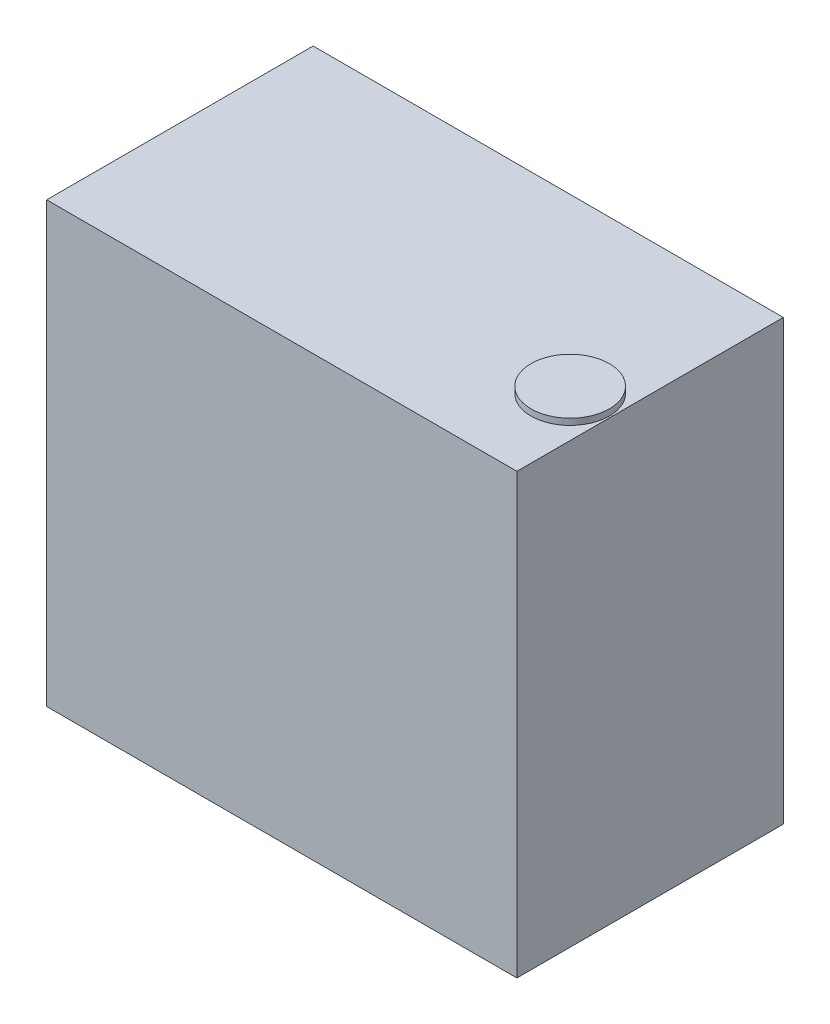
ISO-10303-21;
HEADER;
FILE_DESCRIPTION(('STEP AP214'),'2;1');
FILE_NAME('part.step','',(''),(''),'','','');
FILE_SCHEMA(('AUTOMOTIVE_DESIGN { 1 0 10303 214 1 1 1 1 }'));
ENDSEC;
DATA;
#1=APPLICATION_CONTEXT('core data for automotive mechanical design processes');
#2=APPLICATION_PROTOCOL_DEFINITION('international standard','automotive_design',2000,#1);
#3=PRODUCT_CONTEXT('',#1,'mechanical');
#4=PRODUCT('Part','Part','',(#3));
#5=PRODUCT_RELATED_PRODUCT_CATEGORY('part','',(#4));
#6=PRODUCT_DEFINITION_FORMATION('','',#4);
#7=PRODUCT_DEFINITION_CONTEXT('part definition',#1,'design');
#8=PRODUCT_DEFINITION('design','',#6,#7);
#9=PRODUCT_DEFINITION_SHAPE('','',#8);
#10=(LENGTH_UNIT() NAMED_UNIT(*) SI_UNIT(.MILLI.,.METRE.));
#11=(NAMED_UNIT(*) PLANE_ANGLE_UNIT() SI_UNIT($,.RADIAN.));
#12=(NAMED_UNIT(*) SI_UNIT($,.STERADIAN.) SOLID_ANGLE_UNIT());
#13=UNCERTAINTY_MEASURE_WITH_UNIT(LENGTH_MEASURE(1.E-05),#10,'distance_accuracy_value','');
#14=(GEOMETRIC_REPRESENTATION_CONTEXT(3) GLOBAL_UNCERTAINTY_ASSIGNED_CONTEXT((#13)) GLOBAL_UNIT_ASSIGNED_CONTEXT((#10,
#11,#12)) REPRESENTATION_CONTEXT('',''));
#15=CARTESIAN_POINT('',(0.,0.,0.));
#16=DIRECTION('',(0.,0.,1.));
#17=DIRECTION('',(1.,0.,0.));
#18=AXIS2_PLACEMENT_3D('',#15,#16,#17);
#19=CARTESIAN_POINT('',(0.,0.,85.));
#20=DIRECTION('',(0.,1.,0.));
#21=DIRECTION('',(0.,0.,1.));
#22=AXIS2_PLACEMENT_3D('',#19,#20,#21);
#23=PLANE('',#22);
#24=CARTESIAN_POINT('',(143.,0.,80.));
#25=DIRECTION('',(0.,-1.,0.));
#26=DIRECTION('',(0.,0.,-1.));
#27=AXIS2_PLACEMENT_3D('',#24,#25,#26);
#28=CIRCLE('',#27,1.5);
#29=CARTESIAN_POINT('',(143.,0.,78.5));
#30=VERTEX_POINT('',#29);
#31=EDGE_CURVE('E689',#30,#30,#28,.T.);
#32=ORIENTED_EDGE('',*,*,#31,.F.);
#33=EDGE_LOOP('',(#32));
#34=FACE_BOUND('',#33,.T.);
#35=CARTESIAN_POINT('',(120.,0.,6.00000000000001));
#36=DIRECTION('',(0.,-1.,0.));
#37=DIRECTION('',(0.,0.,-1.));
#38=AXIS2_PLACEMENT_3D('',#35,#36,#37);
#39=CIRCLE('',#38,1.5);
#40=CARTESIAN_POINT('',(120.,0.,4.50000000000001));
#41=VERTEX_POINT('',#40);
#42=EDGE_CURVE('E698',#41,#41,#39,.T.);
#43=ORIENTED_EDGE('',*,*,#42,.F.);
#44=EDGE_LOOP('',(#43));
#45=FACE_BOUND('',#44,.T.);
#46=CARTESIAN_POINT('',(5.,0.,15.));
#47=DIRECTION('',(0.,-1.,0.));
#48=DIRECTION('',(0.,0.,-1.));
#49=AXIS2_PLACEMENT_3D('',#46,#47,#48);
#50=CIRCLE('',#49,1.5);
#51=CARTESIAN_POINT('',(5.,0.,13.5));
#52=VERTEX_POINT('',#51);
#53=EDGE_CURVE('E677',#52,#52,#50,.T.);
#54=ORIENTED_EDGE('',*,*,#53,.F.);
#55=EDGE_LOOP('',(#54));
#56=FACE_BOUND('',#55,.T.);
#57=CARTESIAN_POINT('',(5.,0.,80.));
#58=DIRECTION('',(0.,-1.,0.));
#59=DIRECTION('',(0.,0.,-1.));
#60=AXIS2_PLACEMENT_3D('',#57,#58,#59);
#61=CIRCLE('',#60,1.5);
#62=CARTESIAN_POINT('',(5.,0.,78.5));
#63=VERTEX_POINT('',#62);
#64=EDGE_CURVE('E674',#63,#63,#61,.T.);
#65=ORIENTED_EDGE('',*,*,#64,.F.);
#66=EDGE_LOOP('',(#65));
#67=FACE_BOUND('',#66,.T.);
#68=DIRECTION('',(1.,0.,0.));
#69=VECTOR('',#68,1.);
#70=CARTESIAN_POINT('',(0.,0.,55.));
#71=LINE('',#70,#69);
#72=CARTESIAN_POINT('',(110.,0.,55.));
#73=VERTEX_POINT('',#72);
#74=CARTESIAN_POINT('',(130.,0.,55.));
#75=VERTEX_POINT('',#74);
#76=EDGE_CURVE('E169',#73,#75,#71,.T.);
#77=ORIENTED_EDGE('',*,*,#76,.F.);
#78=DIRECTION('',(0.,0.,1.));
#79=VECTOR('',#78,1.);
#80=CARTESIAN_POINT('',(110.,0.,1.01770443923973E-13));
#81=LINE('',#80,#79);
#82=CARTESIAN_POINT('',(110.,0.,70.));
#83=VERTEX_POINT('',#82);
#84=EDGE_CURVE('E228',#73,#83,#81,.T.);
#85=ORIENTED_EDGE('',*,*,#84,.T.);
#86=DIRECTION('',(1.,0.,0.));
#87=VECTOR('',#86,1.);
#88=CARTESIAN_POINT('',(0.,0.,70.));
#89=LINE('',#88,#87);
#90=CARTESIAN_POINT('',(130.,0.,70.));
#91=VERTEX_POINT('',#90);
#92=EDGE_CURVE('E67',#83,#91,#89,.T.);
#93=ORIENTED_EDGE('',*,*,#92,.T.);
#94=DIRECTION('',(0.,0.,1.));
#95=VECTOR('',#94,1.);
#96=CARTESIAN_POINT('',(130.,0.,0.));
#97=LINE('',#96,#95);
#98=EDGE_CURVE('E243',#75,#91,#97,.T.);
#99=ORIENTED_EDGE('',*,*,#98,.F.);
#100=EDGE_LOOP('',(#77,#85,#93,#99));
#101=FACE_BOUND('',#100,.T.);
#102=DIRECTION('',(1.,0.,0.));
#103=VECTOR('',#102,1.);
#104=CARTESIAN_POINT('',(0.,0.,0.));
#105=LINE('',#104,#103);
#106=CARTESIAN_POINT('',(0.,0.,0.));
#107=VERTEX_POINT('',#106);
#108=CARTESIAN_POINT('',(150.,0.,0.));
#109=VERTEX_POINT('',#108);
#110=EDGE_CURVE('E282',#107,#109,#105,.T.);
#111=ORIENTED_EDGE('',*,*,#110,.T.);
#112=DIRECTION('',(0.,0.,-1.));
#113=VECTOR('',#112,1.);
#114=CARTESIAN_POINT('',(150.,0.,85.));
#115=LINE('',#114,#113);
#116=CARTESIAN_POINT('',(150.,0.,85.));
#117=VERTEX_POINT('',#116);
#118=EDGE_CURVE('E297',#117,#109,#115,.T.);
#119=ORIENTED_EDGE('',*,*,#118,.F.);
#120=DIRECTION('',(1.,0.,0.));
#121=VECTOR('',#120,1.);
#122=CARTESIAN_POINT('',(0.,0.,85.));
#123=LINE('',#122,#121);
#124=CARTESIAN_POINT('',(0.,0.,85.));
#125=VERTEX_POINT('',#124);
#126=EDGE_CURVE('E268',#125,#117,#123,.T.);
#127=ORIENTED_EDGE('',*,*,#126,.F.);
#128=DIRECTION('',(0.,0.,-1.));
#129=VECTOR('',#128,1.);
#130=CARTESIAN_POINT('',(0.,0.,85.));
#131=LINE('',#130,#129);
#132=EDGE_CURVE('E52',#125,#107,#131,.T.);
#133=ORIENTED_EDGE('',*,*,#132,.T.);
#134=EDGE_LOOP('',(#111,#119,#127,#133));
#135=FACE_BOUND('',#134,.T.);
#136=DIRECTION('',(1.,0.,0.));
#137=VECTOR('',#136,1.);
#138=CARTESIAN_POINT('',(0.,0.,13.));
#139=LINE('',#138,#137);
#140=CARTESIAN_POINT('',(104.,0.,13.));
#141=VERTEX_POINT('',#140);
#142=CARTESIAN_POINT('',(134.,0.,13.));
#143=VERTEX_POINT('',#142);
#144=EDGE_CURVE('E164',#141,#143,#139,.T.);
#145=ORIENTED_EDGE('',*,*,#144,.F.);
#146=DIRECTION('',(-0.672672793996313,0.,0.739940073395943));
#147=VECTOR('',#146,1.);
#148=CARTESIAN_POINT('',(63.4117647058823,0.,57.6470588235294));
#149=LINE('',#148,#147);
#150=CARTESIAN_POINT('',(94.,0.,24.));
#151=VERTEX_POINT('',#150);
#152=EDGE_CURVE('E158',#141,#151,#149,.T.);
#153=ORIENTED_EDGE('',*,*,#152,.T.);
#154=DIRECTION('',(0.672672793996313,0.,0.739940073395943));
#155=VECTOR('',#154,1.);
#156=CARTESIAN_POINT('',(39.5203619909502,0.,-35.9276018099548));
#157=LINE('',#156,#155);
#158=CARTESIAN_POINT('',(104.,0.,35.));
#159=VERTEX_POINT('',#158);
#160=EDGE_CURVE('E59',#151,#159,#157,.T.);
#161=ORIENTED_EDGE('',*,*,#160,.T.);
#162=DIRECTION('',(1.,0.,0.));
#163=VECTOR('',#162,1.);
#164=CARTESIAN_POINT('',(0.,0.,35.));
#165=LINE('',#164,#163);
#166=CARTESIAN_POINT('',(134.,0.,35.));
#167=VERTEX_POINT('',#166);
#168=EDGE_CURVE('E201',#159,#167,#165,.T.);
#169=ORIENTED_EDGE('',*,*,#168,.T.);
#170=DIRECTION('',(0.672672793996313,0.,-0.739940073395943));
#171=VECTOR('',#170,1.);
#172=CARTESIAN_POINT('',(90.787330316742,0.,82.5339366515837));
#173=LINE('',#172,#171);
#174=CARTESIAN_POINT('',(144.,0.,24.));
#175=VERTEX_POINT('',#174);
#176=EDGE_CURVE('E197',#167,#175,#173,.T.);
#177=ORIENTED_EDGE('',*,*,#176,.T.);
#178=DIRECTION('',(-0.672672793996313,0.,-0.739940073395943));
#179=VECTOR('',#178,1.);
#180=CARTESIAN_POINT('',(66.8959276018099,0.,-60.8144796380091));
#181=LINE('',#180,#179);
#182=EDGE_CURVE('E193',#175,#143,#181,.T.);
#183=ORIENTED_EDGE('',*,*,#182,.T.);
#184=EDGE_LOOP('',(#145,#153,#161,#169,#177,#183));
#185=FACE_BOUND('',#184,.T.);
#186=ADVANCED_FACE('F43',(#34,#45,#56,#67,#101,#135,#185),#23,.F.);
#187=CARTESIAN_POINT('',(0.,0.,85.));
#188=DIRECTION('',(1.,0.,0.));
#189=DIRECTION('',(0.,0.,-1.));
#190=AXIS2_PLACEMENT_3D('',#187,#188,#189);
#191=PLANE('',#190);
#192=DIRECTION('',(0.,-1.,0.));
#193=VECTOR('',#192,1.);
#194=CARTESIAN_POINT('',(0.,0.,0.));
#195=LINE('',#194,#193);
#196=CARTESIAN_POINT('',(0.,140.,0.));
#197=VERTEX_POINT('',#196);
#198=EDGE_CURVE('E263',#197,#107,#195,.T.);
#199=ORIENTED_EDGE('',*,*,#198,.T.);
#200=ORIENTED_EDGE('',*,*,#132,.F.);
#201=DIRECTION('',(0.,-1.,0.));
#202=VECTOR('',#201,1.);
#203=CARTESIAN_POINT('',(0.,0.,85.));
#204=LINE('',#203,#202);
#205=CARTESIAN_POINT('',(0.,140.,85.));
#206=VERTEX_POINT('',#205);
#207=EDGE_CURVE('E264',#206,#125,#204,.T.);
#208=ORIENTED_EDGE('',*,*,#207,.F.);
#209=DIRECTION('',(0.,0.,-1.));
#210=VECTOR('',#209,1.);
#211=CARTESIAN_POINT('',(0.,140.,85.));
#212=LINE('',#211,#210);
#213=EDGE_CURVE('E278',#206,#197,#212,.T.);
#214=ORIENTED_EDGE('',*,*,#213,.T.);
#215=EDGE_LOOP('',(#199,#200,#208,#214));
#216=FACE_BOUND('',#215,.T.);
#217=ADVANCED_FACE('F45',(#216),#191,.F.);
#218=CARTESIAN_POINT('',(150.,0.,85.));
#219=DIRECTION('',(-1.,0.,0.));
#220=DIRECTION('',(0.,-1.,0.));
#221=AXIS2_PLACEMENT_3D('',#218,#219,#220);
#222=PLANE('',#221);
#223=DIRECTION('',(0.,1.,0.));
#224=VECTOR('',#223,1.);
#225=CARTESIAN_POINT('',(150.,0.,0.));
#226=LINE('',#225,#224);
#227=CARTESIAN_POINT('',(150.,140.,0.));
#228=VERTEX_POINT('',#227);
#229=EDGE_CURVE('E285',#109,#228,#226,.T.);
#230=ORIENTED_EDGE('',*,*,#229,.T.);
#231=DIRECTION('',(0.,0.,-1.));
#232=VECTOR('',#231,1.);
#233=CARTESIAN_POINT('',(150.,140.,85.));
#234=LINE('',#233,#232);
#235=CARTESIAN_POINT('',(150.,140.,85.));
#236=VERTEX_POINT('',#235);
#237=EDGE_CURVE('E293',#236,#228,#234,.T.);
#238=ORIENTED_EDGE('',*,*,#237,.F.);
#239=DIRECTION('',(0.,1.,0.));
#240=VECTOR('',#239,1.);
#241=CARTESIAN_POINT('',(150.,0.,85.));
#242=LINE('',#241,#240);
#243=EDGE_CURVE('E272',#117,#236,#242,.T.);
#244=ORIENTED_EDGE('',*,*,#243,.F.);
#245=ORIENTED_EDGE('',*,*,#118,.T.);
#246=EDGE_LOOP('',(#230,#238,#244,#245));
#247=FACE_BOUND('',#246,.T.);
#248=ADVANCED_FACE('F316',(#247),#222,.F.);
#249=CARTESIAN_POINT('',(0.,140.,85.));
#250=DIRECTION('',(0.,-1.,0.));
#251=DIRECTION('',(0.,0.,-1.));
#252=AXIS2_PLACEMENT_3D('',#249,#250,#251);
#253=PLANE('',#252);
#254=CARTESIAN_POINT('',(137.,140.,55.));
#255=DIRECTION('',(0.,-1.,0.));
#256=DIRECTION('',(0.,0.,-1.));
#257=AXIS2_PLACEMENT_3D('',#254,#255,#256);
#258=CIRCLE('',#257,12.5);
#259=CARTESIAN_POINT('',(137.,140.,42.5));
#260=VERTEX_POINT('',#259);
#261=EDGE_CURVE('E11',#260,#260,#258,.F.);
#262=ORIENTED_EDGE('',*,*,#261,.F.);
#263=EDGE_LOOP('',(#262));
#264=FACE_BOUND('',#263,.T.);
#265=DIRECTION('',(-1.,0.,0.));
#266=VECTOR('',#265,1.);
#267=CARTESIAN_POINT('',(0.,140.,0.));
#268=LINE('',#267,#266);
#269=EDGE_CURVE('E269',#228,#197,#268,.T.);
#270=ORIENTED_EDGE('',*,*,#269,.T.);
#271=ORIENTED_EDGE('',*,*,#213,.F.);
#272=DIRECTION('',(-1.,0.,0.));
#273=VECTOR('',#272,1.);
#274=CARTESIAN_POINT('',(0.,140.,85.));
#275=LINE('',#274,#273);
#276=EDGE_CURVE('E275',#236,#206,#275,.T.);
#277=ORIENTED_EDGE('',*,*,#276,.F.);
#278=ORIENTED_EDGE('',*,*,#237,.T.);
#279=EDGE_LOOP('',(#270,#271,#277,#278));
#280=FACE_BOUND('',#279,.T.);
#281=ADVANCED_FACE('F320',(#264,#280),#253,.F.);
#282=CARTESIAN_POINT('',(0.,0.,85.));
#283=DIRECTION('',(0.,0.,-1.));
#284=DIRECTION('',(-1.,0.,0.));
#285=AXIS2_PLACEMENT_3D('',#282,#283,#284);
#286=PLANE('',#285);
#287=ORIENTED_EDGE('',*,*,#207,.T.);
#288=ORIENTED_EDGE('',*,*,#126,.T.);
#289=ORIENTED_EDGE('',*,*,#243,.T.);
#290=ORIENTED_EDGE('',*,*,#276,.T.);
#291=EDGE_LOOP('',(#287,#288,#289,#290));
#292=FACE_BOUND('',#291,.T.);
#293=ADVANCED_FACE('F322',(#292),#286,.F.);
#294=CARTESIAN_POINT('',(0.,0.,0.));
#295=DIRECTION('',(0.,0.,-1.));
#296=DIRECTION('',(-1.,0.,0.));
#297=AXIS2_PLACEMENT_3D('',#294,#295,#296);
#298=PLANE('',#297);
#299=ORIENTED_EDGE('',*,*,#198,.F.);
#300=ORIENTED_EDGE('',*,*,#269,.F.);
#301=ORIENTED_EDGE('',*,*,#229,.F.);
#302=ORIENTED_EDGE('',*,*,#110,.F.);
#303=EDGE_LOOP('',(#299,#300,#301,#302));
#304=FACE_BOUND('',#303,.T.);
#305=ADVANCED_FACE('F312',(#304),#298,.T.);
#306=CARTESIAN_POINT('',(0.,-4.,55.));
#307=DIRECTION('',(0.,0.,1.));
#308=DIRECTION('',(1.,0.,0.));
#309=AXIS2_PLACEMENT_3D('',#306,#307,#308);
#310=PLANE('',#309);
#311=ORIENTED_EDGE('',*,*,#76,.T.);
#312=DIRECTION('',(0.,1.,0.));
#313=VECTOR('',#312,1.);
#314=CARTESIAN_POINT('',(130.,-4.,55.));
#315=LINE('',#314,#313);
#316=CARTESIAN_POINT('',(130.,-4.,55.));
#317=VERTEX_POINT('',#316);
#318=EDGE_CURVE('E260',#317,#75,#315,.T.);
#319=ORIENTED_EDGE('',*,*,#318,.F.);
#320=DIRECTION('',(1.,0.,0.));
#321=VECTOR('',#320,1.);
#322=CARTESIAN_POINT('',(0.,-4.,55.));
#323=LINE('',#322,#321);
#324=CARTESIAN_POINT('',(110.,-4.,55.));
#325=VERTEX_POINT('',#324);
#326=EDGE_CURVE('E223',#325,#317,#323,.T.);
#327=ORIENTED_EDGE('',*,*,#326,.F.);
#328=DIRECTION('',(0.,1.,0.));
#329=VECTOR('',#328,1.);
#330=CARTESIAN_POINT('',(110.,-4.,55.));
#331=LINE('',#330,#329);
#332=EDGE_CURVE('E239',#325,#73,#331,.T.);
#333=ORIENTED_EDGE('',*,*,#332,.T.);
#334=EDGE_LOOP('',(#311,#319,#327,#333));
#335=FACE_BOUND('',#334,.T.);
#336=ADVANCED_FACE('F329',(#335),#310,.F.);
#337=CARTESIAN_POINT('',(130.,-4.,0.));
#338=DIRECTION('',(-1.,0.,0.));
#339=DIRECTION('',(0.,0.,1.));
#340=AXIS2_PLACEMENT_3D('',#337,#338,#339);
#341=PLANE('',#340);
#342=ORIENTED_EDGE('',*,*,#98,.T.);
#343=DIRECTION('',(0.,1.,0.));
#344=VECTOR('',#343,1.);
#345=CARTESIAN_POINT('',(130.,-4.,70.));
#346=LINE('',#345,#344);
#347=CARTESIAN_POINT('',(130.,-4.,70.));
#348=VERTEX_POINT('',#347);
#349=EDGE_CURVE('E257',#348,#91,#346,.T.);
#350=ORIENTED_EDGE('',*,*,#349,.F.);
#351=DIRECTION('',(0.,0.,1.));
#352=VECTOR('',#351,1.);
#353=CARTESIAN_POINT('',(130.,-4.,0.));
#354=LINE('',#353,#352);
#355=EDGE_CURVE('E227',#317,#348,#354,.T.);
#356=ORIENTED_EDGE('',*,*,#355,.F.);
#357=ORIENTED_EDGE('',*,*,#318,.T.);
#358=EDGE_LOOP('',(#342,#350,#356,#357));
#359=FACE_BOUND('',#358,.T.);
#360=ADVANCED_FACE('F552',(#359),#341,.F.);
#361=CARTESIAN_POINT('',(0.,-4.,70.));
#362=DIRECTION('',(0.,0.,1.));
#363=DIRECTION('',(1.,0.,0.));
#364=AXIS2_PLACEMENT_3D('',#361,#362,#363);
#365=PLANE('',#364);
#366=ORIENTED_EDGE('',*,*,#92,.F.);
#367=DIRECTION('',(0.,1.,0.));
#368=VECTOR('',#367,1.);
#369=CARTESIAN_POINT('',(110.,-4.,70.));
#370=LINE('',#369,#368);
#371=CARTESIAN_POINT('',(110.,-4.,70.));
#372=VERTEX_POINT('',#371);
#373=EDGE_CURVE('E254',#372,#83,#370,.T.);
#374=ORIENTED_EDGE('',*,*,#373,.F.);
#375=DIRECTION('',(1.,0.,0.));
#376=VECTOR('',#375,1.);
#377=CARTESIAN_POINT('',(0.,-4.,70.));
#378=LINE('',#377,#376);
#379=EDGE_CURVE('E231',#372,#348,#378,.T.);
#380=ORIENTED_EDGE('',*,*,#379,.T.);
#381=ORIENTED_EDGE('',*,*,#349,.T.);
#382=EDGE_LOOP('',(#366,#374,#380,#381));
#383=FACE_BOUND('',#382,.T.);
#384=ADVANCED_FACE('F542',(#383),#365,.T.);
#385=CARTESIAN_POINT('',(110.,-4.,1.01770443923973E-13));
#386=DIRECTION('',(-1.,0.,0.));
#387=DIRECTION('',(0.,0.,1.));
#388=AXIS2_PLACEMENT_3D('',#385,#386,#387);
#389=PLANE('',#388);
#390=ORIENTED_EDGE('',*,*,#84,.F.);
#391=ORIENTED_EDGE('',*,*,#332,.F.);
#392=DIRECTION('',(0.,0.,1.));
#393=VECTOR('',#392,1.);
#394=CARTESIAN_POINT('',(110.,-4.,1.01770443923973E-13));
#395=LINE('',#394,#393);
#396=EDGE_CURVE('E235',#325,#372,#395,.T.);
#397=ORIENTED_EDGE('',*,*,#396,.T.);
#398=ORIENTED_EDGE('',*,*,#373,.T.);
#399=EDGE_LOOP('',(#390,#391,#397,#398));
#400=FACE_BOUND('',#399,.T.);
#401=ADVANCED_FACE('F532',(#400),#389,.T.);
#402=CARTESIAN_POINT('',(0.,-4.,0.));
#403=DIRECTION('',(0.,-1.,0.));
#404=DIRECTION('',(0.,0.,-1.));
#405=AXIS2_PLACEMENT_3D('',#402,#403,#404);
#406=PLANE('',#405);
#407=ORIENTED_EDGE('',*,*,#326,.T.);
#408=ORIENTED_EDGE('',*,*,#355,.T.);
#409=ORIENTED_EDGE('',*,*,#379,.F.);
#410=ORIENTED_EDGE('',*,*,#396,.F.);
#411=EDGE_LOOP('',(#407,#408,#409,#410));
#412=FACE_BOUND('',#411,.T.);
#413=ADVANCED_FACE('F523',(#412),#406,.T.);
#414=CARTESIAN_POINT('',(0.,-4.,13.));
#415=DIRECTION('',(0.,0.,1.));
#416=DIRECTION('',(1.,0.,0.));
#417=AXIS2_PLACEMENT_3D('',#414,#415,#416);
#418=PLANE('',#417);
#419=ORIENTED_EDGE('',*,*,#144,.T.);
#420=DIRECTION('',(0.,1.,0.));
#421=VECTOR('',#420,1.);
#422=CARTESIAN_POINT('',(134.,-4.,13.));
#423=LINE('',#422,#421);
#424=CARTESIAN_POINT('',(134.,-4.,13.));
#425=VERTEX_POINT('',#424);
#426=EDGE_CURVE('E161',#425,#143,#423,.T.);
#427=ORIENTED_EDGE('',*,*,#426,.F.);
#428=DIRECTION('',(1.,0.,0.));
#429=VECTOR('',#428,1.);
#430=CARTESIAN_POINT('',(0.,-4.,13.));
#431=LINE('',#430,#429);
#432=CARTESIAN_POINT('',(104.,-4.,13.));
#433=VERTEX_POINT('',#432);
#434=EDGE_CURVE('E146',#433,#425,#431,.T.);
#435=ORIENTED_EDGE('',*,*,#434,.F.);
#436=DIRECTION('',(0.,1.,0.));
#437=VECTOR('',#436,1.);
#438=CARTESIAN_POINT('',(104.,-4.,13.));
#439=LINE('',#438,#437);
#440=EDGE_CURVE('E190',#433,#141,#439,.T.);
#441=ORIENTED_EDGE('',*,*,#440,.T.);
#442=EDGE_LOOP('',(#419,#427,#435,#441));
#443=FACE_BOUND('',#442,.T.);
#444=ADVANCED_FACE('F162',(#443),#418,.F.);
#445=CARTESIAN_POINT('',(66.8959276018099,-4.,-60.8144796380091));
#446=DIRECTION('',(0.739940073395944,0.,-0.672672793996313));
#447=DIRECTION('',(-0.672672793996313,0.,-0.739940073395943));
#448=AXIS2_PLACEMENT_3D('',#445,#446,#447);
#449=PLANE('',#448);
#450=ORIENTED_EDGE('',*,*,#182,.F.);
#451=DIRECTION('',(0.,1.,0.));
#452=VECTOR('',#451,1.);
#453=CARTESIAN_POINT('',(144.,-4.,24.));
#454=LINE('',#453,#452);
#455=CARTESIAN_POINT('',(144.,-4.,24.));
#456=VERTEX_POINT('',#455);
#457=EDGE_CURVE('E170',#456,#175,#454,.T.);
#458=ORIENTED_EDGE('',*,*,#457,.F.);
#459=DIRECTION('',(-0.672672793996313,0.,-0.739940073395943));
#460=VECTOR('',#459,1.);
#461=CARTESIAN_POINT('',(66.8959276018099,-4.,-60.8144796380091));
#462=LINE('',#461,#460);
#463=EDGE_CURVE('E151',#456,#425,#462,.T.);
#464=ORIENTED_EDGE('',*,*,#463,.T.);
#465=ORIENTED_EDGE('',*,*,#426,.T.);
#466=EDGE_LOOP('',(#450,#458,#464,#465));
#467=FACE_BOUND('',#466,.T.);
#468=ADVANCED_FACE('F172',(#467),#449,.T.);
#469=CARTESIAN_POINT('',(90.787330316742,-4.,82.5339366515837));
#470=DIRECTION('',(0.739940073395943,0.,0.672672793996313));
#471=DIRECTION('',(0.672672793996313,0.,-0.739940073395943));
#472=AXIS2_PLACEMENT_3D('',#469,#470,#471);
#473=PLANE('',#472);
#474=ORIENTED_EDGE('',*,*,#176,.F.);
#475=DIRECTION('',(0.,1.,0.));
#476=VECTOR('',#475,1.);
#477=CARTESIAN_POINT('',(134.,-4.,35.));
#478=LINE('',#477,#476);
#479=CARTESIAN_POINT('',(134.,-4.,35.));
#480=VERTEX_POINT('',#479);
#481=EDGE_CURVE('E218',#480,#167,#478,.T.);
#482=ORIENTED_EDGE('',*,*,#481,.F.);
#483=DIRECTION('',(0.672672793996313,0.,-0.739940073395943));
#484=VECTOR('',#483,1.);
#485=CARTESIAN_POINT('',(90.787330316742,-4.,82.5339366515837));
#486=LINE('',#485,#484);
#487=EDGE_CURVE('E174',#480,#456,#486,.T.);
#488=ORIENTED_EDGE('',*,*,#487,.T.);
#489=ORIENTED_EDGE('',*,*,#457,.T.);
#490=EDGE_LOOP('',(#474,#482,#488,#489));
#491=FACE_BOUND('',#490,.T.);
#492=ADVANCED_FACE('F496',(#491),#473,.T.);
#493=CARTESIAN_POINT('',(0.,-4.,35.));
#494=DIRECTION('',(0.,0.,1.));
#495=DIRECTION('',(1.,0.,0.));
#496=AXIS2_PLACEMENT_3D('',#493,#494,#495);
#497=PLANE('',#496);
#498=ORIENTED_EDGE('',*,*,#168,.F.);
#499=DIRECTION('',(0.,1.,0.));
#500=VECTOR('',#499,1.);
#501=CARTESIAN_POINT('',(104.,-4.,35.));
#502=LINE('',#501,#500);
#503=CARTESIAN_POINT('',(104.,-4.,35.));
#504=VERTEX_POINT('',#503);
#505=EDGE_CURVE('E215',#504,#159,#502,.T.);
#506=ORIENTED_EDGE('',*,*,#505,.F.);
#507=DIRECTION('',(1.,0.,0.));
#508=VECTOR('',#507,1.);
#509=CARTESIAN_POINT('',(0.,-4.,35.));
#510=LINE('',#509,#508);
#511=EDGE_CURVE('E177',#504,#480,#510,.T.);
#512=ORIENTED_EDGE('',*,*,#511,.T.);
#513=ORIENTED_EDGE('',*,*,#481,.T.);
#514=EDGE_LOOP('',(#498,#506,#512,#513));
#515=FACE_BOUND('',#514,.T.);
#516=ADVANCED_FACE('F487',(#515),#497,.T.);
#517=CARTESIAN_POINT('',(39.5203619909502,-4.,-35.9276018099548));
#518=DIRECTION('',(-0.739940073395943,0.,0.672672793996313));
#519=DIRECTION('',(0.672672793996313,0.,0.739940073395943));
#520=AXIS2_PLACEMENT_3D('',#517,#518,#519);
#521=PLANE('',#520);
#522=ORIENTED_EDGE('',*,*,#160,.F.);
#523=DIRECTION('',(0.,1.,0.));
#524=VECTOR('',#523,1.);
#525=CARTESIAN_POINT('',(94.,-4.,24.));
#526=LINE('',#525,#524);
#527=CARTESIAN_POINT('',(94.,-4.,24.));
#528=VERTEX_POINT('',#527);
#529=EDGE_CURVE('E212',#528,#151,#526,.T.);
#530=ORIENTED_EDGE('',*,*,#529,.F.);
#531=DIRECTION('',(0.672672793996313,0.,0.739940073395943));
#532=VECTOR('',#531,1.);
#533=CARTESIAN_POINT('',(39.5203619909502,-4.,-35.9276018099548));
#534=LINE('',#533,#532);
#535=EDGE_CURVE('E184',#528,#504,#534,.T.);
#536=ORIENTED_EDGE('',*,*,#535,.T.);
#537=ORIENTED_EDGE('',*,*,#505,.T.);
#538=EDGE_LOOP('',(#522,#530,#536,#537));
#539=FACE_BOUND('',#538,.T.);
#540=ADVANCED_FACE('F477',(#539),#521,.T.);
#541=CARTESIAN_POINT('',(63.4117647058823,-4.,57.6470588235294));
#542=DIRECTION('',(-0.739940073395944,0.,-0.672672793996313));
#543=DIRECTION('',(-0.672672793996313,0.,0.739940073395943));
#544=AXIS2_PLACEMENT_3D('',#541,#542,#543);
#545=PLANE('',#544);
#546=ORIENTED_EDGE('',*,*,#152,.F.);
#547=ORIENTED_EDGE('',*,*,#440,.F.);
#548=DIRECTION('',(-0.672672793996313,0.,0.739940073395943));
#549=VECTOR('',#548,1.);
#550=CARTESIAN_POINT('',(63.4117647058823,-4.,57.6470588235294));
#551=LINE('',#550,#549);
#552=EDGE_CURVE('E155',#433,#528,#551,.T.);
#553=ORIENTED_EDGE('',*,*,#552,.T.);
#554=ORIENTED_EDGE('',*,*,#529,.T.);
#555=EDGE_LOOP('',(#546,#547,#553,#554));
#556=FACE_BOUND('',#555,.T.);
#557=ADVANCED_FACE('F468',(#556),#545,.T.);
#558=CARTESIAN_POINT('',(0.,-4.,0.));
#559=DIRECTION('',(0.,-1.,0.));
#560=DIRECTION('',(0.,0.,-1.));
#561=AXIS2_PLACEMENT_3D('',#558,#559,#560);
#562=PLANE('',#561);
#563=ORIENTED_EDGE('',*,*,#434,.T.);
#564=ORIENTED_EDGE('',*,*,#463,.F.);
#565=ORIENTED_EDGE('',*,*,#487,.F.);
#566=ORIENTED_EDGE('',*,*,#511,.F.);
#567=ORIENTED_EDGE('',*,*,#535,.F.);
#568=ORIENTED_EDGE('',*,*,#552,.F.);
#569=EDGE_LOOP('',(#563,#564,#565,#566,#567,#568));
#570=FACE_BOUND('',#569,.T.);
#571=ADVANCED_FACE('F148',(#570),#562,.T.);
#572=CARTESIAN_POINT('',(5.,10.,80.));
#573=DIRECTION('',(0.,-1.,0.));
#574=DIRECTION('',(0.,0.,-1.));
#575=AXIS2_PLACEMENT_3D('',#572,#573,#574);
#576=CYLINDRICAL_SURFACE('',#575,1.5);
#577=CARTESIAN_POINT('',(5.,10.,80.));
#578=DIRECTION('',(0.,-1.,0.));
#579=DIRECTION('',(0.,0.,-1.));
#580=AXIS2_PLACEMENT_3D('',#577,#578,#579);
#581=CIRCLE('',#580,1.5);
#582=CARTESIAN_POINT('',(5.,10.,78.5));
#583=VERTEX_POINT('',#582);
#584=EDGE_CURVE('E194',#583,#583,#581,.T.);
#585=ORIENTED_EDGE('',*,*,#584,.F.);
#586=EDGE_LOOP('',(#585));
#587=FACE_BOUND('',#586,.T.);
#588=ORIENTED_EDGE('',*,*,#64,.T.);
#589=EDGE_LOOP('',(#588));
#590=FACE_BOUND('',#589,.T.);
#591=ADVANCED_FACE('F448',(#587,#590),#576,.F.);
#592=CARTESIAN_POINT('',(5.,10.,80.));
#593=DIRECTION('',(0.,-1.,0.));
#594=DIRECTION('',(0.,0.,-1.));
#595=AXIS2_PLACEMENT_3D('',#592,#593,#594);
#596=PLANE('',#595);
#597=ORIENTED_EDGE('',*,*,#584,.T.);
#598=EDGE_LOOP('',(#597));
#599=FACE_BOUND('',#598,.T.);
#600=ADVANCED_FACE('F438',(#599),#596,.T.);
#601=CARTESIAN_POINT('',(5.,10.,15.));
#602=DIRECTION('',(0.,-1.,0.));
#603=DIRECTION('',(0.,0.,-1.));
#604=AXIS2_PLACEMENT_3D('',#601,#602,#603);
#605=CYLINDRICAL_SURFACE('',#604,1.5);
#606=CARTESIAN_POINT('',(5.,10.,15.));
#607=DIRECTION('',(0.,-1.,0.));
#608=DIRECTION('',(0.,0.,-1.));
#609=AXIS2_PLACEMENT_3D('',#606,#607,#608);
#610=CIRCLE('',#609,1.5);
#611=CARTESIAN_POINT('',(5.,10.,13.5));
#612=VERTEX_POINT('',#611);
#613=EDGE_CURVE('E682',#612,#612,#610,.T.);
#614=ORIENTED_EDGE('',*,*,#613,.F.);
#615=EDGE_LOOP('',(#614));
#616=FACE_BOUND('',#615,.T.);
#617=ORIENTED_EDGE('',*,*,#53,.T.);
#618=EDGE_LOOP('',(#617));
#619=FACE_BOUND('',#618,.T.);
#620=ADVANCED_FACE('F428',(#616,#619),#605,.F.);
#621=CARTESIAN_POINT('',(5.,10.,15.));
#622=DIRECTION('',(0.,-1.,0.));
#623=DIRECTION('',(0.,0.,-1.));
#624=AXIS2_PLACEMENT_3D('',#621,#622,#623);
#625=PLANE('',#624);
#626=ORIENTED_EDGE('',*,*,#613,.T.);
#627=EDGE_LOOP('',(#626));
#628=FACE_BOUND('',#627,.T.);
#629=ADVANCED_FACE('F418',(#628),#625,.T.);
#630=CARTESIAN_POINT('',(120.,10.,6.00000000000001));
#631=DIRECTION('',(0.,-1.,0.));
#632=DIRECTION('',(0.,0.,-1.));
#633=AXIS2_PLACEMENT_3D('',#630,#631,#632);
#634=CYLINDRICAL_SURFACE('',#633,1.5);
#635=CARTESIAN_POINT('',(120.,10.,6.00000000000001));
#636=DIRECTION('',(0.,-1.,0.));
#637=DIRECTION('',(0.,0.,-1.));
#638=AXIS2_PLACEMENT_3D('',#635,#636,#637);
#639=CIRCLE('',#638,1.5);
#640=CARTESIAN_POINT('',(120.,10.,4.50000000000001));
#641=VERTEX_POINT('',#640);
#642=EDGE_CURVE('E694',#641,#641,#639,.T.);
#643=ORIENTED_EDGE('',*,*,#642,.F.);
#644=EDGE_LOOP('',(#643));
#645=FACE_BOUND('',#644,.T.);
#646=ORIENTED_EDGE('',*,*,#42,.T.);
#647=EDGE_LOOP('',(#646));
#648=FACE_BOUND('',#647,.T.);
#649=ADVANCED_FACE('F408',(#645,#648),#634,.F.);
#650=CARTESIAN_POINT('',(120.,10.,6.00000000000001));
#651=DIRECTION('',(0.,-1.,0.));
#652=DIRECTION('',(0.,0.,-1.));
#653=AXIS2_PLACEMENT_3D('',#650,#651,#652);
#654=PLANE('',#653);
#655=ORIENTED_EDGE('',*,*,#642,.T.);
#656=EDGE_LOOP('',(#655));
#657=FACE_BOUND('',#656,.T.);
#658=ADVANCED_FACE('F399',(#657),#654,.T.);
#659=CARTESIAN_POINT('',(143.,10.,80.));
#660=DIRECTION('',(0.,-1.,0.));
#661=DIRECTION('',(0.,0.,-1.));
#662=AXIS2_PLACEMENT_3D('',#659,#660,#661);
#663=CYLINDRICAL_SURFACE('',#662,1.5);
#664=CARTESIAN_POINT('',(143.,10.,80.));
#665=DIRECTION('',(0.,-1.,0.));
#666=DIRECTION('',(0.,0.,-1.));
#667=AXIS2_PLACEMENT_3D('',#664,#665,#666);
#668=CIRCLE('',#667,1.5);
#669=CARTESIAN_POINT('',(143.,10.,78.5));
#670=VERTEX_POINT('',#669);
#671=EDGE_CURVE('E685',#670,#670,#668,.T.);
#672=ORIENTED_EDGE('',*,*,#671,.F.);
#673=EDGE_LOOP('',(#672));
#674=FACE_BOUND('',#673,.T.);
#675=ORIENTED_EDGE('',*,*,#31,.T.);
#676=EDGE_LOOP('',(#675));
#677=FACE_BOUND('',#676,.T.);
#678=ADVANCED_FACE('F390',(#674,#677),#663,.F.);
#679=CARTESIAN_POINT('',(143.,10.,80.));
#680=DIRECTION('',(0.,-1.,0.));
#681=DIRECTION('',(0.,0.,-1.));
#682=AXIS2_PLACEMENT_3D('',#679,#680,#681);
#683=PLANE('',#682);
#684=ORIENTED_EDGE('',*,*,#671,.T.);
#685=EDGE_LOOP('',(#684));
#686=FACE_BOUND('',#685,.T.);
#687=ADVANCED_FACE('F359',(#686),#683,.T.);
#688=CARTESIAN_POINT('',(137.,142.,55.));
#689=DIRECTION('',(0.,-1.,0.));
#690=DIRECTION('',(0.,0.,-1.));
#691=AXIS2_PLACEMENT_3D('',#688,#689,#690);
#692=CYLINDRICAL_SURFACE('',#691,12.5);
#693=CARTESIAN_POINT('',(137.,142.,55.));
#694=DIRECTION('',(0.,1.,0.));
#695=DIRECTION('',(0.,0.,1.));
#696=AXIS2_PLACEMENT_3D('',#693,#694,#695);
#697=CIRCLE('',#696,12.5);
#698=CARTESIAN_POINT('',(137.,142.,67.5));
#699=VERTEX_POINT('',#698);
#700=EDGE_CURVE('E690',#699,#699,#697,.T.);
#701=ORIENTED_EDGE('',*,*,#700,.F.);
#702=EDGE_LOOP('',(#701));
#703=FACE_BOUND('',#702,.T.);
#704=ORIENTED_EDGE('',*,*,#261,.T.);
#705=EDGE_LOOP('',(#704));
#706=FACE_BOUND('',#705,.T.);
#707=ADVANCED_FACE('F364',(#703,#706),#692,.T.);
#708=CARTESIAN_POINT('',(137.,142.,55.));
#709=DIRECTION('',(0.,1.,0.));
#710=DIRECTION('',(0.,0.,1.));
#711=AXIS2_PLACEMENT_3D('',#708,#709,#710);
#712=PLANE('',#711);
#713=ORIENTED_EDGE('',*,*,#700,.T.);
#714=EDGE_LOOP('',(#713));
#715=FACE_BOUND('',#714,.T.);
#716=ADVANCED_FACE('F369',(#715),#712,.T.);
#717=CLOSED_SHELL('',(#186,#217,#248,#281,#293,#305,#336,#360,#384,#401,#413,#444,#468,#492,
#516,#540,#557,#571,#591,#600,#620,#629,#649,#658,#678,#687,#707,#716));
#718=MANIFOLD_SOLID_BREP('B2',#717);
#719=ADVANCED_BREP_SHAPE_REPRESENTATION('',(#18,#718),#14);
#720=SHAPE_DEFINITION_REPRESENTATION(#9,#719);
ENDSEC;
END-ISO-10303-21;
